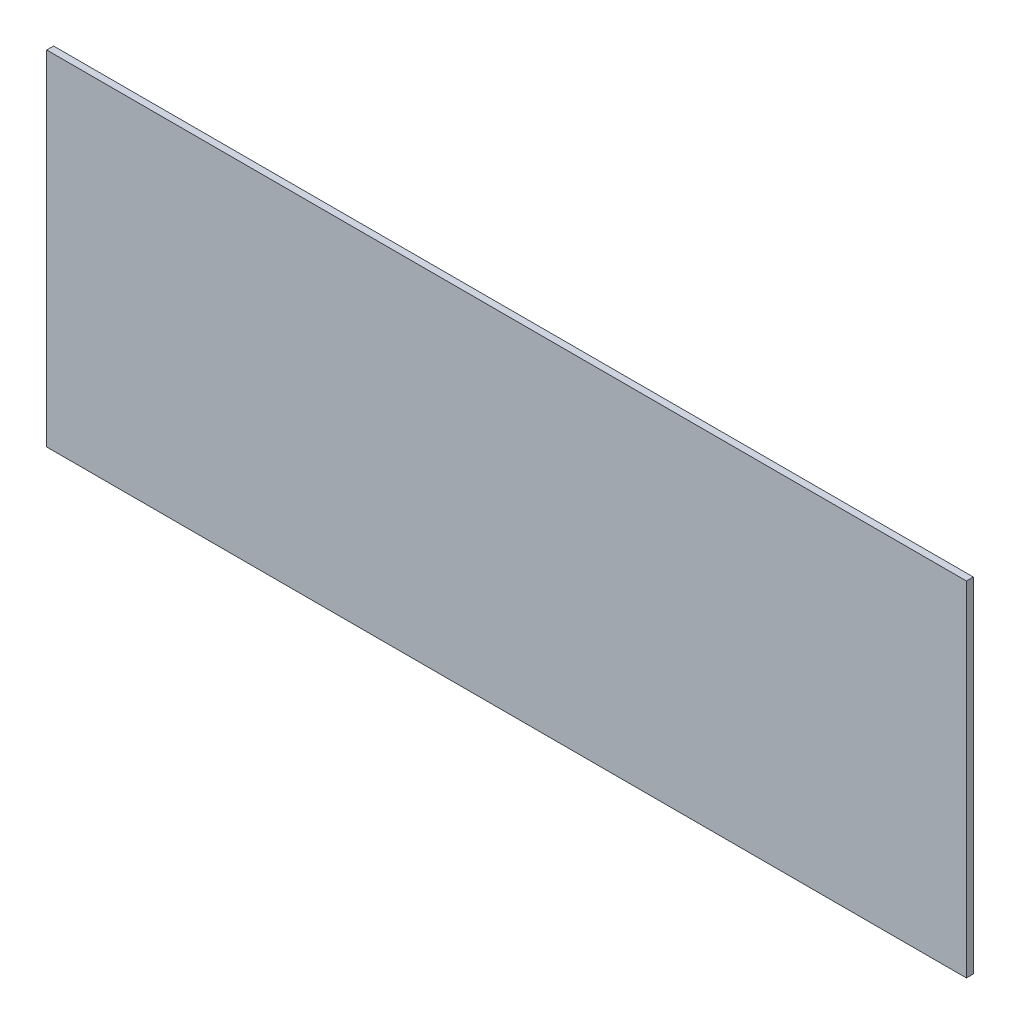
ISO-10303-21;
HEADER;
FILE_DESCRIPTION(('STEP AP214'),'2;1');
FILE_NAME('part.step','',(''),(''),'','','');
FILE_SCHEMA(('AUTOMOTIVE_DESIGN { 1 0 10303 214 1 1 1 1 }'));
ENDSEC;
DATA;
#1=APPLICATION_CONTEXT('core data for automotive mechanical design processes');
#2=APPLICATION_PROTOCOL_DEFINITION('international standard','automotive_design',2000,#1);
#3=PRODUCT_CONTEXT('',#1,'mechanical');
#4=PRODUCT('Part','Part','',(#3));
#5=PRODUCT_RELATED_PRODUCT_CATEGORY('part','',(#4));
#6=PRODUCT_DEFINITION_FORMATION('','',#4);
#7=PRODUCT_DEFINITION_CONTEXT('part definition',#1,'design');
#8=PRODUCT_DEFINITION('design','',#6,#7);
#9=PRODUCT_DEFINITION_SHAPE('','',#8);
#10=(LENGTH_UNIT() NAMED_UNIT(*) SI_UNIT(.MILLI.,.METRE.));
#11=(NAMED_UNIT(*) PLANE_ANGLE_UNIT() SI_UNIT($,.RADIAN.));
#12=(NAMED_UNIT(*) SI_UNIT($,.STERADIAN.) SOLID_ANGLE_UNIT());
#13=UNCERTAINTY_MEASURE_WITH_UNIT(LENGTH_MEASURE(1.E-05),#10,'distance_accuracy_value','');
#14=(GEOMETRIC_REPRESENTATION_CONTEXT(3) GLOBAL_UNCERTAINTY_ASSIGNED_CONTEXT((#13)) GLOBAL_UNIT_ASSIGNED_CONTEXT((#10,
#11,#12)) REPRESENTATION_CONTEXT('',''));
#15=CARTESIAN_POINT('',(0.,0.,0.));
#16=DIRECTION('',(0.,0.,1.));
#17=DIRECTION('',(1.,0.,0.));
#18=AXIS2_PLACEMENT_3D('',#15,#16,#17);
#19=CARTESIAN_POINT('',(-267.5,-100.,4.));
#20=DIRECTION('',(1.,0.,0.));
#21=DIRECTION('',(0.,0.,-1.));
#22=AXIS2_PLACEMENT_3D('',#19,#20,#21);
#23=PLANE('',#22);
#24=DIRECTION('',(0.,-1.,0.));
#25=VECTOR('',#24,1.);
#26=CARTESIAN_POINT('',(-267.5,-100.,0.));
#27=LINE('',#26,#25);
#28=CARTESIAN_POINT('',(-267.5,100.,0.));
#29=VERTEX_POINT('',#28);
#30=CARTESIAN_POINT('',(-267.5,-100.,0.));
#31=VERTEX_POINT('',#30);
#32=EDGE_CURVE('E96',#29,#31,#27,.T.);
#33=ORIENTED_EDGE('',*,*,#32,.T.);
#34=DIRECTION('',(0.,0.,-1.));
#35=VECTOR('',#34,1.);
#36=CARTESIAN_POINT('',(-267.5,-100.,4.));
#37=LINE('',#36,#35);
#38=CARTESIAN_POINT('',(-267.5,-100.,4.));
#39=VERTEX_POINT('',#38);
#40=EDGE_CURVE('E11',#39,#31,#37,.T.);
#41=ORIENTED_EDGE('',*,*,#40,.F.);
#42=DIRECTION('',(0.,-1.,0.));
#43=VECTOR('',#42,1.);
#44=CARTESIAN_POINT('',(-267.5,-100.,4.));
#45=LINE('',#44,#43);
#46=CARTESIAN_POINT('',(-267.5,100.,4.));
#47=VERTEX_POINT('',#46);
#48=EDGE_CURVE('E84',#47,#39,#45,.T.);
#49=ORIENTED_EDGE('',*,*,#48,.F.);
#50=DIRECTION('',(0.,0.,-1.));
#51=VECTOR('',#50,1.);
#52=CARTESIAN_POINT('',(-267.5,100.,4.));
#53=LINE('',#52,#51);
#54=EDGE_CURVE('E92',#47,#29,#53,.T.);
#55=ORIENTED_EDGE('',*,*,#54,.T.);
#56=EDGE_LOOP('',(#33,#41,#49,#55));
#57=FACE_BOUND('',#56,.T.);
#58=ADVANCED_FACE('F33',(#57),#23,.F.);
#59=CARTESIAN_POINT('',(267.5,-100.,4.));
#60=DIRECTION('',(0.,1.,0.));
#61=DIRECTION('',(-1.,0.,0.));
#62=AXIS2_PLACEMENT_3D('',#59,#60,#61);
#63=PLANE('',#62);
#64=DIRECTION('',(1.,0.,0.));
#65=VECTOR('',#64,1.);
#66=CARTESIAN_POINT('',(267.5,-100.,0.));
#67=LINE('',#66,#65);
#68=CARTESIAN_POINT('',(267.5,-100.,0.));
#69=VERTEX_POINT('',#68);
#70=EDGE_CURVE('E88',#31,#69,#67,.T.);
#71=ORIENTED_EDGE('',*,*,#70,.T.);
#72=DIRECTION('',(0.,0.,-1.));
#73=VECTOR('',#72,1.);
#74=CARTESIAN_POINT('',(267.5,-100.,4.));
#75=LINE('',#74,#73);
#76=CARTESIAN_POINT('',(267.5,-100.,4.));
#77=VERTEX_POINT('',#76);
#78=EDGE_CURVE('E41',#77,#69,#75,.T.);
#79=ORIENTED_EDGE('',*,*,#78,.F.);
#80=DIRECTION('',(1.,0.,0.));
#81=VECTOR('',#80,1.);
#82=CARTESIAN_POINT('',(267.5,-100.,4.));
#83=LINE('',#82,#81);
#84=EDGE_CURVE('E79',#39,#77,#83,.T.);
#85=ORIENTED_EDGE('',*,*,#84,.F.);
#86=ORIENTED_EDGE('',*,*,#40,.T.);
#87=EDGE_LOOP('',(#71,#79,#85,#86));
#88=FACE_BOUND('',#87,.T.);
#89=ADVANCED_FACE('F87',(#88),#63,.F.);
#90=CARTESIAN_POINT('',(267.5,-100.,4.));
#91=DIRECTION('',(-1.,0.,0.));
#92=DIRECTION('',(0.,0.,1.));
#93=AXIS2_PLACEMENT_3D('',#90,#91,#92);
#94=PLANE('',#93);
#95=DIRECTION('',(0.,1.,0.));
#96=VECTOR('',#95,1.);
#97=CARTESIAN_POINT('',(267.5,-100.,0.));
#98=LINE('',#97,#96);
#99=CARTESIAN_POINT('',(267.5,100.,0.));
#100=VERTEX_POINT('',#99);
#101=EDGE_CURVE('E66',#69,#100,#98,.T.);
#102=ORIENTED_EDGE('',*,*,#101,.T.);
#103=DIRECTION('',(0.,0.,-1.));
#104=VECTOR('',#103,1.);
#105=CARTESIAN_POINT('',(267.5,100.,4.));
#106=LINE('',#105,#104);
#107=CARTESIAN_POINT('',(267.5,100.,4.));
#108=VERTEX_POINT('',#107);
#109=EDGE_CURVE('E89',#108,#100,#106,.T.);
#110=ORIENTED_EDGE('',*,*,#109,.F.);
#111=DIRECTION('',(0.,1.,0.));
#112=VECTOR('',#111,1.);
#113=CARTESIAN_POINT('',(267.5,-100.,4.));
#114=LINE('',#113,#112);
#115=EDGE_CURVE('E82',#77,#108,#114,.T.);
#116=ORIENTED_EDGE('',*,*,#115,.F.);
#117=ORIENTED_EDGE('',*,*,#78,.T.);
#118=EDGE_LOOP('',(#102,#110,#116,#117));
#119=FACE_BOUND('',#118,.T.);
#120=ADVANCED_FACE('F90',(#119),#94,.F.);
#121=CARTESIAN_POINT('',(267.5,100.,4.));
#122=DIRECTION('',(0.,-1.,0.));
#123=DIRECTION('',(1.,0.,0.));
#124=AXIS2_PLACEMENT_3D('',#121,#122,#123);
#125=PLANE('',#124);
#126=DIRECTION('',(-1.,0.,0.));
#127=VECTOR('',#126,1.);
#128=CARTESIAN_POINT('',(267.5,100.,0.));
#129=LINE('',#128,#127);
#130=EDGE_CURVE('E72',#100,#29,#129,.T.);
#131=ORIENTED_EDGE('',*,*,#130,.T.);
#132=ORIENTED_EDGE('',*,*,#54,.F.);
#133=DIRECTION('',(-1.,0.,0.));
#134=VECTOR('',#133,1.);
#135=CARTESIAN_POINT('',(267.5,100.,4.));
#136=LINE('',#135,#134);
#137=EDGE_CURVE('E49',#108,#47,#136,.T.);
#138=ORIENTED_EDGE('',*,*,#137,.F.);
#139=ORIENTED_EDGE('',*,*,#109,.T.);
#140=EDGE_LOOP('',(#131,#132,#138,#139));
#141=FACE_BOUND('',#140,.T.);
#142=ADVANCED_FACE('F103',(#141),#125,.F.);
#143=CARTESIAN_POINT('',(0.,0.,4.));
#144=DIRECTION('',(0.,0.,1.));
#145=DIRECTION('',(1.,0.,0.));
#146=AXIS2_PLACEMENT_3D('',#143,#144,#145);
#147=PLANE('',#146);
#148=ORIENTED_EDGE('',*,*,#48,.T.);
#149=ORIENTED_EDGE('',*,*,#84,.T.);
#150=ORIENTED_EDGE('',*,*,#115,.T.);
#151=ORIENTED_EDGE('',*,*,#137,.T.);
#152=EDGE_LOOP('',(#148,#149,#150,#151));
#153=FACE_BOUND('',#152,.T.);
#154=ADVANCED_FACE('F80',(#153),#147,.T.);
#155=CARTESIAN_POINT('',(0.,0.,0.));
#156=DIRECTION('',(0.,0.,1.));
#157=DIRECTION('',(1.,0.,0.));
#158=AXIS2_PLACEMENT_3D('',#155,#156,#157);
#159=PLANE('',#158);
#160=ORIENTED_EDGE('',*,*,#32,.F.);
#161=ORIENTED_EDGE('',*,*,#130,.F.);
#162=ORIENTED_EDGE('',*,*,#101,.F.);
#163=ORIENTED_EDGE('',*,*,#70,.F.);
#164=EDGE_LOOP('',(#160,#161,#162,#163));
#165=FACE_BOUND('',#164,.T.);
#166=ADVANCED_FACE('F106',(#165),#159,.F.);
#167=CLOSED_SHELL('',(#58,#89,#120,#142,#154,#166));
#168=MANIFOLD_SOLID_BREP('B2',#167);
#169=ADVANCED_BREP_SHAPE_REPRESENTATION('',(#18,#168),#14);
#170=SHAPE_DEFINITION_REPRESENTATION(#9,#169);
ENDSEC;
END-ISO-10303-21;
